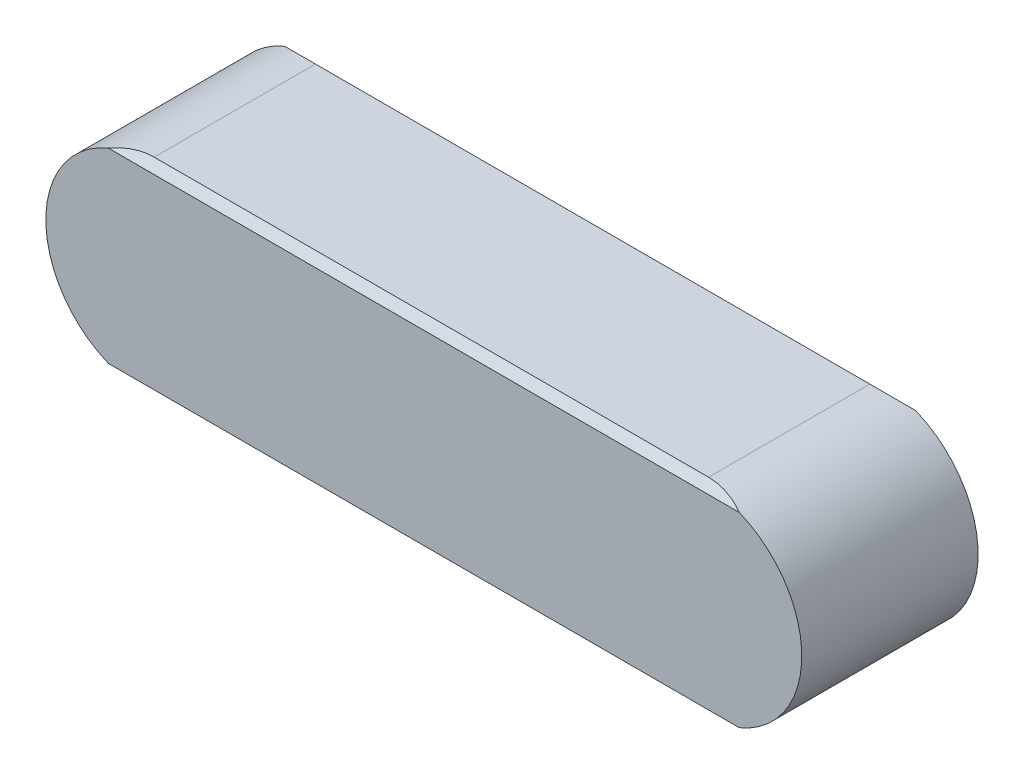
ISO-10303-21;
HEADER;
FILE_DESCRIPTION(('STEP AP214'),'2;1');
FILE_NAME('part.step','',(''),(''),'','','');
FILE_SCHEMA(('AUTOMOTIVE_DESIGN { 1 0 10303 214 1 1 1 1 }'));
ENDSEC;
DATA;
#1=APPLICATION_CONTEXT('core data for automotive mechanical design processes');
#2=APPLICATION_PROTOCOL_DEFINITION('international standard','automotive_design',2000,#1);
#3=PRODUCT_CONTEXT('',#1,'mechanical');
#4=PRODUCT('Part','Part','',(#3));
#5=PRODUCT_RELATED_PRODUCT_CATEGORY('part','',(#4));
#6=PRODUCT_DEFINITION_FORMATION('','',#4);
#7=PRODUCT_DEFINITION_CONTEXT('part definition',#1,'design');
#8=PRODUCT_DEFINITION('design','',#6,#7);
#9=PRODUCT_DEFINITION_SHAPE('','',#8);
#10=(LENGTH_UNIT() NAMED_UNIT(*) SI_UNIT(.MILLI.,.METRE.));
#11=(NAMED_UNIT(*) PLANE_ANGLE_UNIT() SI_UNIT($,.RADIAN.));
#12=(NAMED_UNIT(*) SI_UNIT($,.STERADIAN.) SOLID_ANGLE_UNIT());
#13=UNCERTAINTY_MEASURE_WITH_UNIT(LENGTH_MEASURE(1.E-05),#10,'distance_accuracy_value','');
#14=(GEOMETRIC_REPRESENTATION_CONTEXT(3) GLOBAL_UNCERTAINTY_ASSIGNED_CONTEXT((#13)) GLOBAL_UNIT_ASSIGNED_CONTEXT((#10,
#11,#12)) REPRESENTATION_CONTEXT('',''));
#15=CARTESIAN_POINT('',(0.,0.,0.));
#16=DIRECTION('',(0.,0.,1.));
#17=DIRECTION('',(1.,0.,0.));
#18=AXIS2_PLACEMENT_3D('',#15,#16,#17);
#19=CARTESIAN_POINT('',(0.,7.7,0.));
#20=DIRECTION('',(0.,-0.707106781186548,0.707106781186547));
#21=DIRECTION('',(0.,-0.707106781186547,-0.707106781186548));
#22=AXIS2_PLACEMENT_3D('',#19,#20,#21);
#23=PLANE('',#22);
#24=DIRECTION('',(1.,0.,0.));
#25=VECTOR('',#24,1.);
#26=CARTESIAN_POINT('',(0.,7.7,0.));
#27=LINE('',#26,#25);
#28=CARTESIAN_POINT('',(27.5198684153571,7.7,0.));
#29=VERTEX_POINT('',#28);
#30=CARTESIAN_POINT('',(2.48013158464293,7.7,0.));
#31=VERTEX_POINT('',#30);
#32=EDGE_CURVE('E91',#29,#31,#27,.F.);
#33=ORIENTED_EDGE('',*,*,#32,.T.);
#34=CARTESIAN_POINT('',(4.,4.,-3.70000000000001));
#35=DIRECTION('',(0.,-0.707106781186548,0.707106781186547));
#36=DIRECTION('',(0.,-0.707106781186547,-0.707106781186548));
#37=AXIS2_PLACEMENT_3D('',#34,#35,#36);
#38=ELLIPSE('',#37,5.65685424949238,4.);
#39=CARTESIAN_POINT('',(4.,8.,0.299999999999999));
#40=VERTEX_POINT('',#39);
#41=EDGE_CURVE('E20',#40,#31,#38,.T.);
#42=ORIENTED_EDGE('',*,*,#41,.F.);
#43=DIRECTION('',(1.,0.,0.));
#44=VECTOR('',#43,1.);
#45=CARTESIAN_POINT('',(4.,8.,0.299999999999997));
#46=LINE('',#45,#44);
#47=CARTESIAN_POINT('',(26.,8.,0.299999999999999));
#48=VERTEX_POINT('',#47);
#49=EDGE_CURVE('E96',#48,#40,#46,.F.);
#50=ORIENTED_EDGE('',*,*,#49,.F.);
#51=CARTESIAN_POINT('',(26.,4.,-3.70000000000001));
#52=DIRECTION('',(0.,-0.707106781186548,0.707106781186547));
#53=DIRECTION('',(0.,-0.707106781186547,-0.707106781186548));
#54=AXIS2_PLACEMENT_3D('',#51,#52,#53);
#55=ELLIPSE('',#54,5.65685424949238,4.);
#56=EDGE_CURVE('E89',#29,#48,#55,.T.);
#57=ORIENTED_EDGE('',*,*,#56,.F.);
#58=EDGE_LOOP('',(#33,#42,#50,#57));
#59=FACE_BOUND('',#58,.T.);
#60=ADVANCED_FACE('F17',(#59),#23,.F.);
#61=CARTESIAN_POINT('',(0.,0.,0.3));
#62=DIRECTION('',(0.,0.707106781186547,0.707106781186548));
#63=DIRECTION('',(0.,-0.707106781186548,0.707106781186547));
#64=AXIS2_PLACEMENT_3D('',#61,#62,#63);
#65=PLANE('',#64);
#66=DIRECTION('',(1.,0.,0.));
#67=VECTOR('',#66,1.);
#68=CARTESIAN_POINT('',(26.,0.,0.3));
#69=LINE('',#68,#67);
#70=CARTESIAN_POINT('',(4.,0.,0.3));
#71=VERTEX_POINT('',#70);
#72=CARTESIAN_POINT('',(26.,0.,0.3));
#73=VERTEX_POINT('',#72);
#74=EDGE_CURVE('E142',#71,#73,#69,.T.);
#75=ORIENTED_EDGE('',*,*,#74,.F.);
#76=CARTESIAN_POINT('',(4.,4.,-3.69999999999999));
#77=DIRECTION('',(0.,0.707106781186547,0.707106781186548));
#78=DIRECTION('',(0.,0.707106781186548,-0.707106781186547));
#79=AXIS2_PLACEMENT_3D('',#76,#77,#78);
#80=ELLIPSE('',#79,5.65685424949238,4.);
#81=CARTESIAN_POINT('',(2.48013158464293,0.3,0.));
#82=VERTEX_POINT('',#81);
#83=EDGE_CURVE('E127',#82,#71,#80,.T.);
#84=ORIENTED_EDGE('',*,*,#83,.F.);
#85=DIRECTION('',(1.,0.,0.));
#86=VECTOR('',#85,1.);
#87=CARTESIAN_POINT('',(0.,0.3,0.));
#88=LINE('',#87,#86);
#89=CARTESIAN_POINT('',(27.5198684153571,0.3,0.));
#90=VERTEX_POINT('',#89);
#91=EDGE_CURVE('E95',#82,#90,#88,.T.);
#92=ORIENTED_EDGE('',*,*,#91,.T.);
#93=CARTESIAN_POINT('',(26.,4.,-3.69999999999999));
#94=DIRECTION('',(0.,0.707106781186547,0.707106781186548));
#95=DIRECTION('',(0.,0.707106781186548,-0.707106781186547));
#96=AXIS2_PLACEMENT_3D('',#93,#94,#95);
#97=ELLIPSE('',#96,5.65685424949238,4.);
#98=EDGE_CURVE('E125',#73,#90,#97,.T.);
#99=ORIENTED_EDGE('',*,*,#98,.F.);
#100=EDGE_LOOP('',(#75,#84,#92,#99));
#101=FACE_BOUND('',#100,.T.);
#102=ADVANCED_FACE('F147',(#101),#65,.F.);
#103=CARTESIAN_POINT('',(4.,8.,0.));
#104=DIRECTION('',(0.,1.,0.));
#105=DIRECTION('',(0.,0.,1.));
#106=AXIS2_PLACEMENT_3D('',#103,#104,#105);
#107=PLANE('',#106);
#108=ORIENTED_EDGE('',*,*,#49,.T.);
#109=DIRECTION('',(0.,0.,-1.));
#110=VECTOR('',#109,1.);
#111=CARTESIAN_POINT('',(4.,8.,0.));
#112=LINE('',#111,#110);
#113=CARTESIAN_POINT('',(4.,8.,6.7));
#114=VERTEX_POINT('',#113);
#115=EDGE_CURVE('E88',#114,#40,#112,.T.);
#116=ORIENTED_EDGE('',*,*,#115,.F.);
#117=DIRECTION('',(1.,0.,0.));
#118=VECTOR('',#117,1.);
#119=CARTESIAN_POINT('',(0.,8.,6.7));
#120=LINE('',#119,#118);
#121=CARTESIAN_POINT('',(26.,8.,6.7));
#122=VERTEX_POINT('',#121);
#123=EDGE_CURVE('E116',#114,#122,#120,.T.);
#124=ORIENTED_EDGE('',*,*,#123,.T.);
#125=DIRECTION('',(0.,0.,-1.));
#126=VECTOR('',#125,1.);
#127=CARTESIAN_POINT('',(26.,8.,0.));
#128=LINE('',#127,#126);
#129=EDGE_CURVE('E119',#48,#122,#128,.F.);
#130=ORIENTED_EDGE('',*,*,#129,.F.);
#131=EDGE_LOOP('',(#108,#116,#124,#130));
#132=FACE_BOUND('',#131,.T.);
#133=ADVANCED_FACE('F135',(#132),#107,.T.);
#134=CARTESIAN_POINT('',(0.,0.,0.));
#135=DIRECTION('',(0.,0.,1.));
#136=DIRECTION('',(1.,0.,0.));
#137=AXIS2_PLACEMENT_3D('',#134,#135,#136);
#138=PLANE('',#137);
#139=CARTESIAN_POINT('',(4.,4.,0.));
#140=DIRECTION('',(0.,0.,-1.));
#141=DIRECTION('',(-1.,0.,0.));
#142=AXIS2_PLACEMENT_3D('',#139,#140,#141);
#143=CIRCLE('',#142,4.);
#144=EDGE_CURVE('E86',#31,#82,#143,.F.);
#145=ORIENTED_EDGE('',*,*,#144,.F.);
#146=ORIENTED_EDGE('',*,*,#32,.F.);
#147=CARTESIAN_POINT('',(26.,4.,0.));
#148=DIRECTION('',(0.,0.,-1.));
#149=DIRECTION('',(-1.,0.,0.));
#150=AXIS2_PLACEMENT_3D('',#147,#148,#149);
#151=CIRCLE('',#150,4.);
#152=EDGE_CURVE('E117',#90,#29,#151,.F.);
#153=ORIENTED_EDGE('',*,*,#152,.F.);
#154=ORIENTED_EDGE('',*,*,#91,.F.);
#155=EDGE_LOOP('',(#145,#146,#153,#154));
#156=FACE_BOUND('',#155,.T.);
#157=ADVANCED_FACE('F99',(#156),#138,.F.);
#158=CARTESIAN_POINT('',(26.,0.,0.));
#159=DIRECTION('',(0.,-1.,0.));
#160=DIRECTION('',(0.,0.,-1.));
#161=AXIS2_PLACEMENT_3D('',#158,#159,#160);
#162=PLANE('',#161);
#163=ORIENTED_EDGE('',*,*,#74,.T.);
#164=DIRECTION('',(0.,0.,-1.));
#165=VECTOR('',#164,1.);
#166=CARTESIAN_POINT('',(26.,0.,0.));
#167=LINE('',#166,#165);
#168=CARTESIAN_POINT('',(26.,0.,6.7));
#169=VERTEX_POINT('',#168);
#170=EDGE_CURVE('E120',#169,#73,#167,.T.);
#171=ORIENTED_EDGE('',*,*,#170,.F.);
#172=DIRECTION('',(1.,0.,0.));
#173=VECTOR('',#172,1.);
#174=CARTESIAN_POINT('',(0.,0.,6.7));
#175=LINE('',#174,#173);
#176=CARTESIAN_POINT('',(4.,0.,6.7));
#177=VERTEX_POINT('',#176);
#178=EDGE_CURVE('E124',#169,#177,#175,.F.);
#179=ORIENTED_EDGE('',*,*,#178,.T.);
#180=DIRECTION('',(0.,0.,-1.));
#181=VECTOR('',#180,1.);
#182=CARTESIAN_POINT('',(4.,0.,0.));
#183=LINE('',#182,#181);
#184=EDGE_CURVE('E101',#71,#177,#183,.F.);
#185=ORIENTED_EDGE('',*,*,#184,.F.);
#186=EDGE_LOOP('',(#163,#171,#179,#185));
#187=FACE_BOUND('',#186,.T.);
#188=ADVANCED_FACE('F151',(#187),#162,.T.);
#189=CARTESIAN_POINT('',(0.,0.3,7.));
#190=DIRECTION('',(0.,0.707106781186548,-0.707106781186548));
#191=DIRECTION('',(0.,0.707106781186548,0.707106781186548));
#192=AXIS2_PLACEMENT_3D('',#189,#190,#191);
#193=PLANE('',#192);
#194=DIRECTION('',(1.,0.,0.));
#195=VECTOR('',#194,1.);
#196=CARTESIAN_POINT('',(0.,0.3,7.));
#197=LINE('',#196,#195);
#198=CARTESIAN_POINT('',(2.48013158464293,0.3,7.));
#199=VERTEX_POINT('',#198);
#200=CARTESIAN_POINT('',(27.5198684153571,0.3,7.));
#201=VERTEX_POINT('',#200);
#202=EDGE_CURVE('E104',#199,#201,#197,.T.);
#203=ORIENTED_EDGE('',*,*,#202,.F.);
#204=CARTESIAN_POINT('',(4.,4.,10.7));
#205=DIRECTION('',(0.,0.707106781186548,-0.707106781186548));
#206=DIRECTION('',(0.,-0.707106781186548,-0.707106781186548));
#207=AXIS2_PLACEMENT_3D('',#204,#205,#206);
#208=ELLIPSE('',#207,5.65685424949238,4.);
#209=EDGE_CURVE('E111',#177,#199,#208,.T.);
#210=ORIENTED_EDGE('',*,*,#209,.F.);
#211=ORIENTED_EDGE('',*,*,#178,.F.);
#212=CARTESIAN_POINT('',(26.,4.,10.7));
#213=DIRECTION('',(0.,0.707106781186548,-0.707106781186548));
#214=DIRECTION('',(0.,-0.707106781186548,-0.707106781186548));
#215=AXIS2_PLACEMENT_3D('',#212,#213,#214);
#216=ELLIPSE('',#215,5.65685424949238,4.);
#217=EDGE_CURVE('E121',#201,#169,#216,.T.);
#218=ORIENTED_EDGE('',*,*,#217,.F.);
#219=EDGE_LOOP('',(#203,#210,#211,#218));
#220=FACE_BOUND('',#219,.T.);
#221=ADVANCED_FACE('F154',(#220),#193,.F.);
#222=CARTESIAN_POINT('',(26.,4.,0.));
#223=DIRECTION('',(0.,0.,-1.));
#224=DIRECTION('',(-1.,0.,0.));
#225=AXIS2_PLACEMENT_3D('',#222,#223,#224);
#226=CYLINDRICAL_SURFACE('',#225,4.);
#227=CARTESIAN_POINT('',(26.,4.,10.7));
#228=DIRECTION('',(0.,-0.707106781186548,-0.707106781186548));
#229=DIRECTION('',(0.,0.707106781186548,-0.707106781186548));
#230=AXIS2_PLACEMENT_3D('',#227,#228,#229);
#231=ELLIPSE('',#230,5.65685424949238,4.);
#232=CARTESIAN_POINT('',(27.5198684153571,7.7,7.));
#233=VERTEX_POINT('',#232);
#234=EDGE_CURVE('E114',#122,#233,#231,.T.);
#235=ORIENTED_EDGE('',*,*,#234,.T.);
#236=CARTESIAN_POINT('',(26.,4.,7.));
#237=DIRECTION('',(0.,0.,-1.));
#238=DIRECTION('',(-1.,0.,0.));
#239=AXIS2_PLACEMENT_3D('',#236,#237,#238);
#240=CIRCLE('',#239,4.);
#241=EDGE_CURVE('E109',#201,#233,#240,.F.);
#242=ORIENTED_EDGE('',*,*,#241,.F.);
#243=ORIENTED_EDGE('',*,*,#217,.T.);
#244=ORIENTED_EDGE('',*,*,#170,.T.);
#245=ORIENTED_EDGE('',*,*,#98,.T.);
#246=ORIENTED_EDGE('',*,*,#152,.T.);
#247=ORIENTED_EDGE('',*,*,#56,.T.);
#248=ORIENTED_EDGE('',*,*,#129,.T.);
#249=EDGE_LOOP('',(#235,#242,#243,#244,#245,#246,#247,#248));
#250=FACE_BOUND('',#249,.T.);
#251=ADVANCED_FACE('F130',(#250),#226,.T.);
#252=CARTESIAN_POINT('',(0.,8.,6.7));
#253=DIRECTION('',(0.,-0.707106781186548,-0.707106781186548));
#254=DIRECTION('',(0.,0.707106781186548,-0.707106781186548));
#255=AXIS2_PLACEMENT_3D('',#252,#253,#254);
#256=PLANE('',#255);
#257=ORIENTED_EDGE('',*,*,#123,.F.);
#258=CARTESIAN_POINT('',(4.,4.,10.7));
#259=DIRECTION('',(0.,-0.707106781186548,-0.707106781186548));
#260=DIRECTION('',(0.,0.707106781186548,-0.707106781186548));
#261=AXIS2_PLACEMENT_3D('',#258,#259,#260);
#262=ELLIPSE('',#261,5.65685424949238,4.);
#263=CARTESIAN_POINT('',(2.48013158464293,7.7,7.));
#264=VERTEX_POINT('',#263);
#265=EDGE_CURVE('E35',#264,#114,#262,.T.);
#266=ORIENTED_EDGE('',*,*,#265,.F.);
#267=DIRECTION('',(1.,0.,0.));
#268=VECTOR('',#267,1.);
#269=CARTESIAN_POINT('',(0.,7.7,7.));
#270=LINE('',#269,#268);
#271=EDGE_CURVE('E26',#233,#264,#270,.F.);
#272=ORIENTED_EDGE('',*,*,#271,.F.);
#273=ORIENTED_EDGE('',*,*,#234,.F.);
#274=EDGE_LOOP('',(#257,#266,#272,#273));
#275=FACE_BOUND('',#274,.T.);
#276=ADVANCED_FACE('F163',(#275),#256,.F.);
#277=CARTESIAN_POINT('',(4.,4.,0.));
#278=DIRECTION('',(0.,0.,-1.));
#279=DIRECTION('',(-1.,0.,0.));
#280=AXIS2_PLACEMENT_3D('',#277,#278,#279);
#281=CYLINDRICAL_SURFACE('',#280,4.);
#282=ORIENTED_EDGE('',*,*,#83,.T.);
#283=ORIENTED_EDGE('',*,*,#184,.T.);
#284=ORIENTED_EDGE('',*,*,#209,.T.);
#285=CARTESIAN_POINT('',(4.,4.,7.));
#286=DIRECTION('',(0.,0.,-1.));
#287=DIRECTION('',(-1.,0.,0.));
#288=AXIS2_PLACEMENT_3D('',#285,#286,#287);
#289=CIRCLE('',#288,4.);
#290=EDGE_CURVE('E11',#264,#199,#289,.F.);
#291=ORIENTED_EDGE('',*,*,#290,.F.);
#292=ORIENTED_EDGE('',*,*,#265,.T.);
#293=ORIENTED_EDGE('',*,*,#115,.T.);
#294=ORIENTED_EDGE('',*,*,#41,.T.);
#295=ORIENTED_EDGE('',*,*,#144,.T.);
#296=EDGE_LOOP('',(#282,#283,#284,#291,#292,#293,#294,#295));
#297=FACE_BOUND('',#296,.T.);
#298=ADVANCED_FACE('F84',(#297),#281,.T.);
#299=CARTESIAN_POINT('',(0.,0.,7.));
#300=DIRECTION('',(0.,0.,1.));
#301=DIRECTION('',(1.,0.,0.));
#302=AXIS2_PLACEMENT_3D('',#299,#300,#301);
#303=PLANE('',#302);
#304=ORIENTED_EDGE('',*,*,#271,.T.);
#305=ORIENTED_EDGE('',*,*,#290,.T.);
#306=ORIENTED_EDGE('',*,*,#202,.T.);
#307=ORIENTED_EDGE('',*,*,#241,.T.);
#308=EDGE_LOOP('',(#304,#305,#306,#307));
#309=FACE_BOUND('',#308,.T.);
#310=ADVANCED_FACE('F162',(#309),#303,.T.);
#311=CLOSED_SHELL('',(#60,#102,#133,#157,#188,#221,#251,#276,#298,#310));
#312=MANIFOLD_SOLID_BREP('B1',#311);
#313=ADVANCED_BREP_SHAPE_REPRESENTATION('',(#18,#312),#14);
#314=SHAPE_DEFINITION_REPRESENTATION(#9,#313);
ENDSEC;
END-ISO-10303-21;
